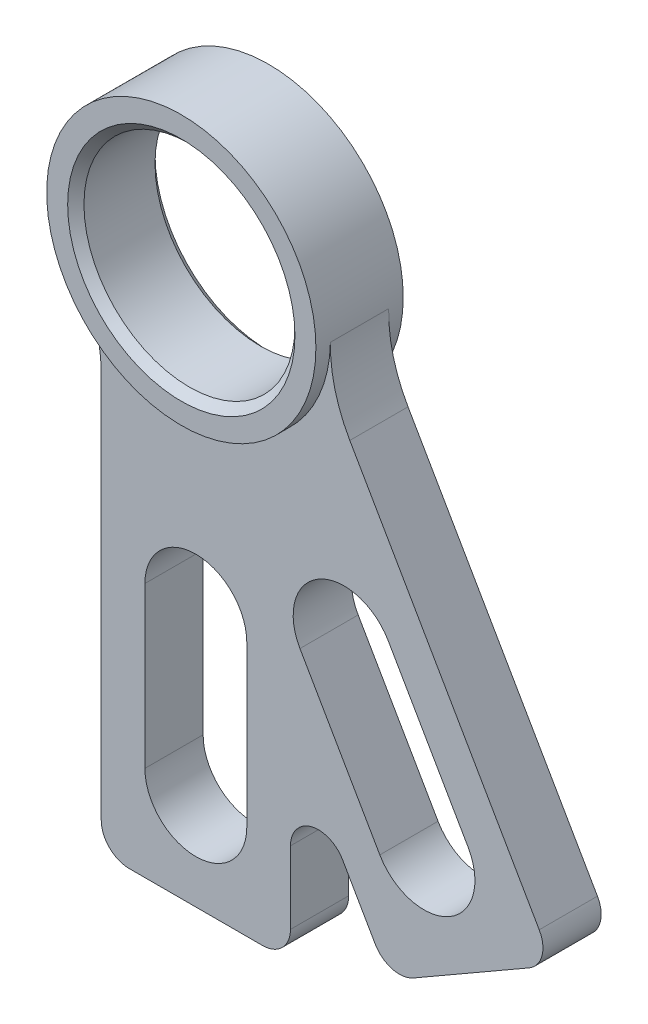
ISO-10303-21;
HEADER;
FILE_DESCRIPTION(('STEP AP214'),'2;1');
FILE_NAME('part.step','',(''),(''),'','','');
FILE_SCHEMA(('AUTOMOTIVE_DESIGN { 1 0 10303 214 1 1 1 1 }'));
ENDSEC;
DATA;
#1=APPLICATION_CONTEXT('core data for automotive mechanical design processes');
#2=APPLICATION_PROTOCOL_DEFINITION('international standard','automotive_design',2000,#1);
#3=PRODUCT_CONTEXT('',#1,'mechanical');
#4=PRODUCT('Part','Part','',(#3));
#5=PRODUCT_RELATED_PRODUCT_CATEGORY('part','',(#4));
#6=PRODUCT_DEFINITION_FORMATION('','',#4);
#7=PRODUCT_DEFINITION_CONTEXT('part definition',#1,'design');
#8=PRODUCT_DEFINITION('design','',#6,#7);
#9=PRODUCT_DEFINITION_SHAPE('','',#8);
#10=(LENGTH_UNIT() NAMED_UNIT(*) SI_UNIT(.MILLI.,.METRE.));
#11=(NAMED_UNIT(*) PLANE_ANGLE_UNIT() SI_UNIT($,.RADIAN.));
#12=(NAMED_UNIT(*) SI_UNIT($,.STERADIAN.) SOLID_ANGLE_UNIT());
#13=UNCERTAINTY_MEASURE_WITH_UNIT(LENGTH_MEASURE(1.E-05),#10,'distance_accuracy_value','');
#14=(GEOMETRIC_REPRESENTATION_CONTEXT(3) GLOBAL_UNCERTAINTY_ASSIGNED_CONTEXT((#13)) GLOBAL_UNIT_ASSIGNED_CONTEXT((#10,
#11,#12)) REPRESENTATION_CONTEXT('',''));
#15=CARTESIAN_POINT('',(0.,0.,0.));
#16=DIRECTION('',(0.,0.,1.));
#17=DIRECTION('',(1.,0.,0.));
#18=AXIS2_PLACEMENT_3D('',#15,#16,#17);
#19=CARTESIAN_POINT('',(-3.4936420527291E-13,-1.7668066561072E-13,4.7625));
#20=DIRECTION('',(0.,0.,-1.));
#21=DIRECTION('',(-1.,0.,0.));
#22=AXIS2_PLACEMENT_3D('',#19,#20,#21);
#23=CYLINDRICAL_SURFACE('',#22,11.5062000000004);
#24=CARTESIAN_POINT('',(-3.4936420527291E-13,-1.7668066561072E-13,-3.87350000000003));
#25=DIRECTION('',(0.,0.,1.));
#26=DIRECTION('',(1.,0.,0.));
#27=AXIS2_PLACEMENT_3D('',#24,#25,#26);
#28=CIRCLE('',#27,11.5062000000004);
#29=CARTESIAN_POINT('',(-11.5062000000007,-1.7668066561072E-13,-3.87350000000003));
#30=VERTEX_POINT('',#29);
#31=EDGE_CURVE('E56',#30,#30,#28,.F.);
#32=CARTESIAN_POINT('',(-3.4936420527291E-13,-1.7668066561072E-13,3.87349999999995));
#33=DIRECTION('',(0.,0.,1.));
#34=DIRECTION('',(1.,0.,0.));
#35=AXIS2_PLACEMENT_3D('',#32,#33,#34);
#36=CIRCLE('',#35,11.5062000000004);
#37=CARTESIAN_POINT('',(-11.5062000000007,-1.7668066561072E-13,3.87349999999995));
#38=VERTEX_POINT('',#37);
#39=EDGE_CURVE('E452',#38,#38,#36,.T.);
#40=CARTESIAN_POINT('',(-11.5062000000007,-1.7668066561072E-13,-3.87350000000003));
#41=CARTESIAN_POINT('',(-11.5062000000007,-1.7668066561072E-13,-3.79280208333336));
#42=CARTESIAN_POINT('',(-11.5062000000007,-1.7668066561072E-13,-3.71210416666669));
#43=CARTESIAN_POINT('',(-11.5062000000007,-1.7668066561072E-13,-3.55070833333336));
#44=CARTESIAN_POINT('',(-11.5062000000007,-1.7668066561072E-13,-3.47001041666669));
#45=CARTESIAN_POINT('',(-11.5062000000007,-1.7668066561072E-13,-3.30861458333336));
#46=CARTESIAN_POINT('',(-11.5062000000007,-1.7668066561072E-13,-3.2279166666667));
#47=CARTESIAN_POINT('',(-11.5062000000007,-1.7668066561072E-13,-3.06652083333336));
#48=CARTESIAN_POINT('',(-11.5062000000007,-1.7668066561072E-13,-2.9858229166667));
#49=CARTESIAN_POINT('',(-11.5062000000007,-1.7668066561072E-13,-2.82442708333336));
#50=CARTESIAN_POINT('',(-11.5062000000007,-1.7668066561072E-13,-2.7437291666667));
#51=CARTESIAN_POINT('',(-11.5062000000007,-1.7668066561072E-13,-2.58233333333336));
#52=CARTESIAN_POINT('',(-11.5062000000007,-1.7668066561072E-13,-2.5016354166667));
#53=CARTESIAN_POINT('',(-11.5062000000007,-1.7668066561072E-13,-2.34023958333337));
#54=CARTESIAN_POINT('',(-11.5062000000007,-1.7668066561072E-13,-2.2595416666667));
#55=CARTESIAN_POINT('',(-11.5062000000007,-1.7668066561072E-13,-2.09814583333337));
#56=CARTESIAN_POINT('',(-11.5062000000007,-1.7668066561072E-13,-2.0174479166667));
#57=CARTESIAN_POINT('',(-11.5062000000007,-1.7668066561072E-13,-1.85605208333337));
#58=CARTESIAN_POINT('',(-11.5062000000007,-1.7668066561072E-13,-1.7753541666667));
#59=CARTESIAN_POINT('',(-11.5062000000007,-1.7668066561072E-13,-1.61395833333337));
#60=CARTESIAN_POINT('',(-11.5062000000007,-1.7668066561072E-13,-1.5332604166667));
#61=CARTESIAN_POINT('',(-11.5062000000007,-1.7668066561072E-13,-1.37186458333337));
#62=CARTESIAN_POINT('',(-11.5062000000007,-1.7668066561072E-13,-1.2911666666667));
#63=CARTESIAN_POINT('',(-11.5062000000007,-1.7668066561072E-13,-1.12977083333337));
#64=CARTESIAN_POINT('',(-11.5062000000007,-1.7668066561072E-13,-1.0490729166667));
#65=CARTESIAN_POINT('',(-11.5062000000007,-1.7668066561072E-13,-0.887677083333368));
#66=CARTESIAN_POINT('',(-11.5062000000007,-1.7668066561072E-13,-0.806979166666702));
#67=CARTESIAN_POINT('',(-11.5062000000007,-1.7668066561072E-13,-0.645583333333369));
#68=CARTESIAN_POINT('',(-11.5062000000007,-1.7668066561072E-13,-0.564885416666703));
#69=CARTESIAN_POINT('',(-11.5062000000007,-1.7668066561072E-13,-0.40348958333337));
#70=CARTESIAN_POINT('',(-11.5062000000007,-1.7668066561072E-13,-0.322791666666703));
#71=CARTESIAN_POINT('',(-11.5062000000007,-1.7668066561072E-13,-0.16139583333337));
#72=CARTESIAN_POINT('',(-11.5062000000007,-1.7668066561072E-13,-0.0806979166667037));
#73=CARTESIAN_POINT('',(-11.5062000000007,-1.7668066561072E-13,0.0806979166666291));
#74=CARTESIAN_POINT('',(-11.5062000000007,-1.7668066561072E-13,0.161395833333296));
#75=CARTESIAN_POINT('',(-11.5062000000007,-1.7668066561072E-13,0.322791666666628));
#76=CARTESIAN_POINT('',(-11.5062000000007,-1.7668066561072E-13,0.403489583333295));
#77=CARTESIAN_POINT('',(-11.5062000000007,-1.7668066561072E-13,0.564885416666628));
#78=CARTESIAN_POINT('',(-11.5062000000007,-1.7668066561072E-13,0.645583333333295));
#79=CARTESIAN_POINT('',(-11.5062000000007,-1.7668066561072E-13,0.806979166666628));
#80=CARTESIAN_POINT('',(-11.5062000000007,-1.7668066561072E-13,0.887677083333294));
#81=CARTESIAN_POINT('',(-11.5062000000007,-1.7668066561072E-13,1.04907291666663));
#82=CARTESIAN_POINT('',(-11.5062000000007,-1.7668066561072E-13,1.12977083333329));
#83=CARTESIAN_POINT('',(-11.5062000000007,-1.7668066561072E-13,1.29116666666663));
#84=CARTESIAN_POINT('',(-11.5062000000007,-1.7668066561072E-13,1.37186458333329));
#85=CARTESIAN_POINT('',(-11.5062000000007,-1.7668066561072E-13,1.53326041666663));
#86=CARTESIAN_POINT('',(-11.5062000000007,-1.7668066561072E-13,1.61395833333329));
#87=CARTESIAN_POINT('',(-11.5062000000007,-1.7668066561072E-13,1.77535416666662));
#88=CARTESIAN_POINT('',(-11.5062000000007,-1.7668066561072E-13,1.85605208333329));
#89=CARTESIAN_POINT('',(-11.5062000000007,-1.7668066561072E-13,2.01744791666662));
#90=CARTESIAN_POINT('',(-11.5062000000007,-1.7668066561072E-13,2.09814583333329));
#91=CARTESIAN_POINT('',(-11.5062000000007,-1.7668066561072E-13,2.25954166666662));
#92=CARTESIAN_POINT('',(-11.5062000000007,-1.7668066561072E-13,2.34023958333329));
#93=CARTESIAN_POINT('',(-11.5062000000007,-1.7668066561072E-13,2.50163541666662));
#94=CARTESIAN_POINT('',(-11.5062000000007,-1.7668066561072E-13,2.58233333333329));
#95=CARTESIAN_POINT('',(-11.5062000000007,-1.7668066561072E-13,2.74372916666662));
#96=CARTESIAN_POINT('',(-11.5062000000007,-1.7668066561072E-13,2.82442708333329));
#97=CARTESIAN_POINT('',(-11.5062000000007,-1.7668066561072E-13,2.98582291666662));
#98=CARTESIAN_POINT('',(-11.5062000000007,-1.7668066561072E-13,3.06652083333329));
#99=CARTESIAN_POINT('',(-11.5062000000007,-1.7668066561072E-13,3.22791666666662));
#100=CARTESIAN_POINT('',(-11.5062000000007,-1.7668066561072E-13,3.30861458333329));
#101=CARTESIAN_POINT('',(-11.5062000000007,-1.7668066561072E-13,3.47001041666662));
#102=CARTESIAN_POINT('',(-11.5062000000007,-1.7668066561072E-13,3.55070833333329));
#103=CARTESIAN_POINT('',(-11.5062000000007,-1.7668066561072E-13,3.71210416666662));
#104=CARTESIAN_POINT('',(-11.5062000000007,-1.7668066561072E-13,3.79280208333329));
#105=CARTESIAN_POINT('',(-11.5062000000007,-1.7668066561072E-13,3.87349999999995));
#106=B_SPLINE_CURVE_WITH_KNOTS('',3,(#40,#41,#42,#43,#44,#45,#46,#47,#48,#49,#50,#51,#52,#53,
#54,#55,#56,#57,#58,#59,#60,#61,#62,#63,#64,#65,#66,#67,#68,#69,#70,#71,#72,#73,#74,#75,#76,#77,
#78,#79,#80,#81,#82,#83,#84,#85,#86,#87,#88,#89,#90,#91,#92,#93,#94,#95,#96,#97,#98,#99,#100,
#101,#102,#103,#104,#105),.UNSPECIFIED.,.F.,.F.,(4,2,2,2,2,2,2,2,2,2,2,2,2,2,2,2,2,2,2,2,2,2,2,
2,2,2,2,2,2,2,2,2,4),(0.,0.24209375,0.484187499999998,0.726281249999999,0.968374999999997,
1.21046875,1.4525625,1.69465624999999,1.93674999999999,2.17884374999999,2.42093749999999,
2.66303124999999,2.90512499999999,3.14721874999999,3.38931249999999,3.63140624999999,
3.87349999999999,4.11559374999999,4.35768749999999,4.59978124999999,4.84187499999999,
5.08396874999999,5.32606249999999,5.56815624999998,5.81024999999998,6.05234374999998,
6.29443749999998,6.53653124999998,6.77862499999998,7.02071874999998,7.26281249999998,
7.50490624999998,7.74699999999998),.UNSPECIFIED.);
#107=EDGE_CURVE('BSEAM47',#30,#38,#106,.T.);
#108=ORIENTED_EDGE('',*,*,#31,.T.);
#109=ORIENTED_EDGE('',*,*,#39,.T.);
#110=ORIENTED_EDGE('',*,*,#107,.T.);
#111=ORIENTED_EDGE('',*,*,#107,.F.);
#112=EDGE_LOOP('',(#108,#110,#109,#111));
#113=FACE_BOUND('',#112,.T.);
#114=ADVANCED_FACE('F47',(#113),#23,.F.);
#115=CARTESIAN_POINT('',(-3.4936420527291E-13,-1.7668066561072E-13,4.7625));
#116=DIRECTION('',(0.,0.,-1.));
#117=DIRECTION('',(-1.,0.,0.));
#118=AXIS2_PLACEMENT_3D('',#115,#116,#117);
#119=CYLINDRICAL_SURFACE('',#118,14.6812);
#120=DIRECTION('',(0.,0.,-1.));
#121=VECTOR('',#120,1.);
#122=CARTESIAN_POINT('',(-12.5851932668323,-7.55979787272707,3.175));
#123=LINE('',#122,#121);
#124=CARTESIAN_POINT('',(-12.585193266832,-7.55979787272686,3.175));
#125=VERTEX_POINT('',#124);
#126=CARTESIAN_POINT('',(-12.5851932668323,-7.55979787272707,-3.175));
#127=VERTEX_POINT('',#126);
#128=EDGE_CURVE('E211',#125,#127,#123,.T.);
#129=ORIENTED_EDGE('',*,*,#128,.F.);
#130=CARTESIAN_POINT('',(-3.4936420527291E-13,-1.7668066561072E-13,3.175));
#131=DIRECTION('',(0.,0.,1.));
#132=DIRECTION('',(1.,0.,0.));
#133=AXIS2_PLACEMENT_3D('',#130,#131,#132);
#134=CIRCLE('',#133,14.6812);
#135=CARTESIAN_POINT('',(14.6786412074877,-0.274090754757125,3.175));
#136=VERTEX_POINT('',#135);
#137=EDGE_CURVE('E228',#125,#136,#134,.T.);
#138=ORIENTED_EDGE('',*,*,#137,.T.);
#139=DIRECTION('',(0.,0.,-1.));
#140=VECTOR('',#139,1.);
#141=CARTESIAN_POINT('',(14.6786412074874,-0.274090754757023,3.175));
#142=LINE('',#141,#140);
#143=CARTESIAN_POINT('',(14.6786412074874,-0.274090754757023,-3.175));
#144=VERTEX_POINT('',#143);
#145=EDGE_CURVE('E284',#136,#144,#142,.T.);
#146=ORIENTED_EDGE('',*,*,#145,.T.);
#147=CARTESIAN_POINT('',(-3.4936420527291E-13,-1.7668066561072E-13,-3.175));
#148=DIRECTION('',(0.,0.,1.));
#149=DIRECTION('',(1.,0.,0.));
#150=AXIS2_PLACEMENT_3D('',#147,#148,#149);
#151=CIRCLE('',#150,14.6812);
#152=EDGE_CURVE('E285',#127,#144,#151,.T.);
#153=ORIENTED_EDGE('',*,*,#152,.F.);
#154=EDGE_LOOP('',(#129,#138,#146,#153));
#155=FACE_BOUND('',#154,.T.);
#156=CARTESIAN_POINT('',(-3.4936420527291E-13,-1.7668066561072E-13,4.7625));
#157=DIRECTION('',(0.,0.,1.));
#158=DIRECTION('',(1.,0.,0.));
#159=AXIS2_PLACEMENT_3D('',#156,#157,#158);
#160=CIRCLE('',#159,14.6812);
#161=CARTESIAN_POINT('',(14.6811999999996,-1.7668066561072E-13,4.7625));
#162=VERTEX_POINT('',#161);
#163=EDGE_CURVE('E379',#162,#162,#160,.T.);
#164=ORIENTED_EDGE('',*,*,#163,.F.);
#165=EDGE_LOOP('',(#164));
#166=FACE_BOUND('',#165,.T.);
#167=CARTESIAN_POINT('',(-3.4936420527291E-13,-1.7668066561072E-13,-4.7625));
#168=DIRECTION('',(0.,0.,1.));
#169=DIRECTION('',(1.,0.,0.));
#170=AXIS2_PLACEMENT_3D('',#167,#168,#169);
#171=CIRCLE('',#170,14.6812);
#172=CARTESIAN_POINT('',(14.6811999999996,-1.7668066561072E-13,-4.7625));
#173=VERTEX_POINT('',#172);
#174=EDGE_CURVE('E360',#173,#173,#171,.T.);
#175=ORIENTED_EDGE('',*,*,#174,.T.);
#176=EDGE_LOOP('',(#175));
#177=FACE_BOUND('',#176,.T.);
#178=ADVANCED_FACE('F475',(#155,#166,#177),#119,.T.);
#179=CARTESIAN_POINT('',(0.,0.,4.7625));
#180=DIRECTION('',(0.,0.,1.));
#181=DIRECTION('',(1.,0.,0.));
#182=AXIS2_PLACEMENT_3D('',#179,#180,#181);
#183=PLANE('',#182);
#184=CARTESIAN_POINT('',(-3.4936420527291E-13,-1.7668066561072E-13,4.7625));
#185=DIRECTION('',(0.,0.,1.));
#186=DIRECTION('',(1.,0.,0.));
#187=AXIS2_PLACEMENT_3D('',#184,#185,#186);
#188=CIRCLE('',#187,12.3952000000004);
#189=CARTESIAN_POINT('',(12.3952000000001,-1.7668066561072E-13,4.7625));
#190=VERTEX_POINT('',#189);
#191=EDGE_CURVE('E11',#190,#190,#188,.F.);
#192=ORIENTED_EDGE('',*,*,#191,.T.);
#193=EDGE_LOOP('',(#192));
#194=FACE_BOUND('',#193,.T.);
#195=ORIENTED_EDGE('',*,*,#163,.T.);
#196=EDGE_LOOP('',(#195));
#197=FACE_BOUND('',#196,.T.);
#198=ADVANCED_FACE('F471',(#194,#197),#183,.T.);
#199=CARTESIAN_POINT('',(0.,0.,-4.7625));
#200=DIRECTION('',(0.,0.,1.));
#201=DIRECTION('',(1.,0.,0.));
#202=AXIS2_PLACEMENT_3D('',#199,#200,#201);
#203=PLANE('',#202);
#204=CARTESIAN_POINT('',(-3.4936420527291E-13,-1.7668066561072E-13,-4.7625));
#205=DIRECTION('',(0.,0.,1.));
#206=DIRECTION('',(1.,0.,0.));
#207=AXIS2_PLACEMENT_3D('',#204,#205,#206);
#208=CIRCLE('',#207,12.3952000000004);
#209=CARTESIAN_POINT('',(12.3952,-1.7668066561072E-13,-4.7625));
#210=VERTEX_POINT('',#209);
#211=EDGE_CURVE('E448',#210,#210,#208,.T.);
#212=ORIENTED_EDGE('',*,*,#211,.T.);
#213=EDGE_LOOP('',(#212));
#214=FACE_BOUND('',#213,.T.);
#215=ORIENTED_EDGE('',*,*,#174,.F.);
#216=EDGE_LOOP('',(#215));
#217=FACE_BOUND('',#216,.T.);
#218=ADVANCED_FACE('F467',(#214,#217),#203,.F.);
#219=CARTESIAN_POINT('',(0.,-33.1787499999983,3.175));
#220=DIRECTION('',(0.,0.,-1.));
#221=DIRECTION('',(-1.,0.,0.));
#222=AXIS2_PLACEMENT_3D('',#219,#220,#221);
#223=CYLINDRICAL_SURFACE('',#222,5.55624999999838);
#224=CARTESIAN_POINT('',(0.,-33.1787499999983,-3.175));
#225=DIRECTION('',(0.,0.,1.));
#226=DIRECTION('',(1.,0.,0.));
#227=AXIS2_PLACEMENT_3D('',#224,#225,#226);
#228=CIRCLE('',#227,5.55624999999838);
#229=CARTESIAN_POINT('',(5.55624999999832,-33.1787499999983,-3.175));
#230=VERTEX_POINT('',#229);
#231=CARTESIAN_POINT('',(-5.55624999999843,-33.1787499999983,-3.175));
#232=VERTEX_POINT('',#231);
#233=EDGE_CURVE('E332',#230,#232,#228,.T.);
#234=ORIENTED_EDGE('',*,*,#233,.F.);
#235=DIRECTION('',(0.,0.,-1.));
#236=VECTOR('',#235,1.);
#237=CARTESIAN_POINT('',(5.55624999999832,-33.1787499999983,3.175));
#238=LINE('',#237,#236);
#239=CARTESIAN_POINT('',(5.55624999999832,-33.1787499999983,3.175));
#240=VERTEX_POINT('',#239);
#241=EDGE_CURVE('E357',#240,#230,#238,.T.);
#242=ORIENTED_EDGE('',*,*,#241,.F.);
#243=CARTESIAN_POINT('',(0.,-33.1787499999983,3.175));
#244=DIRECTION('',(0.,0.,1.));
#245=DIRECTION('',(1.,0.,0.));
#246=AXIS2_PLACEMENT_3D('',#243,#244,#245);
#247=CIRCLE('',#246,5.55624999999838);
#248=CARTESIAN_POINT('',(-5.55624999999843,-33.1787499999983,3.175));
#249=VERTEX_POINT('',#248);
#250=EDGE_CURVE('E269',#240,#249,#247,.T.);
#251=ORIENTED_EDGE('',*,*,#250,.T.);
#252=DIRECTION('',(0.,0.,-1.));
#253=VECTOR('',#252,1.);
#254=CARTESIAN_POINT('',(-5.55624999999843,-33.1787499999983,3.175));
#255=LINE('',#254,#253);
#256=EDGE_CURVE('E347',#249,#232,#255,.T.);
#257=ORIENTED_EDGE('',*,*,#256,.T.);
#258=EDGE_LOOP('',(#234,#242,#251,#257));
#259=FACE_BOUND('',#258,.T.);
#260=ADVANCED_FACE('F470',(#259),#223,.F.);
#261=CARTESIAN_POINT('',(5.55624999999827,0.,3.175));
#262=DIRECTION('',(-1.,0.,0.));
#263=DIRECTION('',(0.,-1.,0.));
#264=AXIS2_PLACEMENT_3D('',#261,#262,#263);
#265=PLANE('',#264);
#266=DIRECTION('',(0.,1.,0.));
#267=VECTOR('',#266,1.);
#268=CARTESIAN_POINT('',(5.55624999999827,0.,-3.175));
#269=LINE('',#268,#267);
#270=CARTESIAN_POINT('',(5.55624999999835,-50.6412500000016,-3.175));
#271=VERTEX_POINT('',#270);
#272=EDGE_CURVE('E336',#271,#230,#269,.T.);
#273=ORIENTED_EDGE('',*,*,#272,.F.);
#274=DIRECTION('',(0.,0.,-1.));
#275=VECTOR('',#274,1.);
#276=CARTESIAN_POINT('',(5.55624999999835,-50.6412500000016,3.175));
#277=LINE('',#276,#275);
#278=CARTESIAN_POINT('',(5.55624999999835,-50.6412500000016,3.175));
#279=VERTEX_POINT('',#278);
#280=EDGE_CURVE('E354',#279,#271,#277,.T.);
#281=ORIENTED_EDGE('',*,*,#280,.F.);
#282=DIRECTION('',(0.,1.,0.));
#283=VECTOR('',#282,1.);
#284=CARTESIAN_POINT('',(5.55624999999827,0.,3.175));
#285=LINE('',#284,#283);
#286=EDGE_CURVE('E273',#279,#240,#285,.T.);
#287=ORIENTED_EDGE('',*,*,#286,.T.);
#288=ORIENTED_EDGE('',*,*,#241,.T.);
#289=EDGE_LOOP('',(#273,#281,#287,#288));
#290=FACE_BOUND('',#289,.T.);
#291=ADVANCED_FACE('F615',(#290),#265,.T.);
#292=CARTESIAN_POINT('',(-1.15768157845534E-13,-50.6412500000016,3.175));
#293=DIRECTION('',(0.,0.,-1.));
#294=DIRECTION('',(-1.,0.,0.));
#295=AXIS2_PLACEMENT_3D('',#292,#293,#294);
#296=CYLINDRICAL_SURFACE('',#295,5.5562499999984);
#297=CARTESIAN_POINT('',(-1.15768157845534E-13,-50.6412500000016,-3.175));
#298=DIRECTION('',(0.,0.,1.));
#299=DIRECTION('',(1.,0.,0.));
#300=AXIS2_PLACEMENT_3D('',#297,#298,#299);
#301=CIRCLE('',#300,5.5562499999984);
#302=CARTESIAN_POINT('',(-5.55624999999846,-50.6412500000016,-3.175));
#303=VERTEX_POINT('',#302);
#304=EDGE_CURVE('E340',#303,#271,#301,.T.);
#305=ORIENTED_EDGE('',*,*,#304,.F.);
#306=DIRECTION('',(0.,0.,-1.));
#307=VECTOR('',#306,1.);
#308=CARTESIAN_POINT('',(-5.55624999999846,-50.6412500000016,3.175));
#309=LINE('',#308,#307);
#310=CARTESIAN_POINT('',(-5.55624999999846,-50.6412500000016,3.175));
#311=VERTEX_POINT('',#310);
#312=EDGE_CURVE('E350',#311,#303,#309,.T.);
#313=ORIENTED_EDGE('',*,*,#312,.F.);
#314=CARTESIAN_POINT('',(-1.15768157845534E-13,-50.6412500000016,3.175));
#315=DIRECTION('',(0.,0.,1.));
#316=DIRECTION('',(1.,0.,0.));
#317=AXIS2_PLACEMENT_3D('',#314,#315,#316);
#318=CIRCLE('',#317,5.5562499999984);
#319=EDGE_CURVE('E277',#311,#279,#318,.T.);
#320=ORIENTED_EDGE('',*,*,#319,.T.);
#321=ORIENTED_EDGE('',*,*,#280,.T.);
#322=EDGE_LOOP('',(#305,#313,#320,#321));
#323=FACE_BOUND('',#322,.T.);
#324=ADVANCED_FACE('F583',(#323),#296,.F.);
#325=CARTESIAN_POINT('',(16.1699182596924,-28.0941728733446,3.175));
#326=DIRECTION('',(0.,0.,-1.));
#327=DIRECTION('',(-1.,0.,0.));
#328=AXIS2_PLACEMENT_3D('',#325,#326,#327);
#329=CYLINDRICAL_SURFACE('',#328,5.55624999999839);
#330=CARTESIAN_POINT('',(16.1699182596924,-28.0941728733446,-3.175));
#331=DIRECTION('',(0.,0.,1.));
#332=DIRECTION('',(1.,0.,0.));
#333=AXIS2_PLACEMENT_3D('',#330,#331,#332);
#334=CIRCLE('',#333,5.55624999999839);
#335=CARTESIAN_POINT('',(20.9854979726825,-25.3225116223398,-3.175));
#336=VERTEX_POINT('',#335);
#337=CARTESIAN_POINT('',(11.3543385467024,-30.8658341243493,-3.175));
#338=VERTEX_POINT('',#337);
#339=EDGE_CURVE('E316',#336,#338,#334,.T.);
#340=ORIENTED_EDGE('',*,*,#339,.F.);
#341=DIRECTION('',(0.,0.,-1.));
#342=VECTOR('',#341,1.);
#343=CARTESIAN_POINT('',(20.9854979726825,-25.3225116223398,3.175));
#344=LINE('',#343,#342);
#345=CARTESIAN_POINT('',(20.9854979726825,-25.3225116223398,3.175));
#346=VERTEX_POINT('',#345);
#347=EDGE_CURVE('E351',#346,#336,#344,.T.);
#348=ORIENTED_EDGE('',*,*,#347,.F.);
#349=CARTESIAN_POINT('',(16.1699182596924,-28.0941728733446,3.175));
#350=DIRECTION('',(0.,0.,1.));
#351=DIRECTION('',(1.,0.,0.));
#352=AXIS2_PLACEMENT_3D('',#349,#350,#351);
#353=CIRCLE('',#352,5.55624999999839);
#354=CARTESIAN_POINT('',(11.3543385467024,-30.8658341243493,3.175));
#355=VERTEX_POINT('',#354);
#356=EDGE_CURVE('E254',#346,#355,#353,.T.);
#357=ORIENTED_EDGE('',*,*,#356,.T.);
#358=DIRECTION('',(0.,0.,-1.));
#359=VECTOR('',#358,1.);
#360=CARTESIAN_POINT('',(11.3543385467024,-30.8658341243493,3.175));
#361=LINE('',#360,#359);
#362=EDGE_CURVE('E361',#355,#338,#361,.T.);
#363=ORIENTED_EDGE('',*,*,#362,.T.);
#364=EDGE_LOOP('',(#340,#348,#357,#363));
#365=FACE_BOUND('',#364,.T.);
#366=ADVANCED_FACE('F575',(#365),#329,.F.);
#367=CARTESIAN_POINT('',(4.81557971299104,2.77166125100526,3.175));
#368=DIRECTION('',(-0.866696011337042,-0.498836670597163,0.));
#369=DIRECTION('',(0.498836670597163,-0.866696011337042,0.));
#370=AXIS2_PLACEMENT_3D('',#367,#368,#369);
#371=PLANE('',#370);
#372=DIRECTION('',(-0.498836670597163,0.866696011337042,0.));
#373=VECTOR('',#372,1.);
#374=CARTESIAN_POINT('',(4.81557971299104,2.77166125100526,-3.175));
#375=LINE('',#374,#373);
#376=CARTESIAN_POINT('',(29.6964333329867,-40.4571907203151,-3.175));
#377=VERTEX_POINT('',#376);
#378=EDGE_CURVE('E320',#377,#336,#375,.T.);
#379=ORIENTED_EDGE('',*,*,#378,.F.);
#380=DIRECTION('',(0.,0.,-1.));
#381=VECTOR('',#380,1.);
#382=CARTESIAN_POINT('',(29.6964333329867,-40.4571907203151,3.175));
#383=LINE('',#382,#381);
#384=CARTESIAN_POINT('',(29.6964333329867,-40.4571907203151,3.175));
#385=VERTEX_POINT('',#384);
#386=EDGE_CURVE('E367',#385,#377,#383,.T.);
#387=ORIENTED_EDGE('',*,*,#386,.F.);
#388=DIRECTION('',(-0.498836670597163,0.866696011337042,0.));
#389=VECTOR('',#388,1.);
#390=CARTESIAN_POINT('',(4.81557971299104,2.77166125100526,3.175));
#391=LINE('',#390,#389);
#392=EDGE_CURVE('E258',#385,#346,#391,.T.);
#393=ORIENTED_EDGE('',*,*,#392,.T.);
#394=ORIENTED_EDGE('',*,*,#347,.T.);
#395=EDGE_LOOP('',(#379,#387,#393,#394));
#396=FACE_BOUND('',#395,.T.);
#397=ADVANCED_FACE('F569',(#396),#371,.T.);
#398=CARTESIAN_POINT('',(24.8808536199966,-43.2288519713197,3.175));
#399=DIRECTION('',(0.,0.,-1.));
#400=DIRECTION('',(-1.,0.,0.));
#401=AXIS2_PLACEMENT_3D('',#398,#399,#400);
#402=CYLINDRICAL_SURFACE('',#401,5.55624999999839);
#403=CARTESIAN_POINT('',(24.8808536199966,-43.2288519713197,-3.175));
#404=DIRECTION('',(0.,0.,1.));
#405=DIRECTION('',(1.,0.,0.));
#406=AXIS2_PLACEMENT_3D('',#403,#404,#405);
#407=CIRCLE('',#406,5.55624999999839);
#408=CARTESIAN_POINT('',(20.0652739070066,-46.0005132223244,-3.175));
#409=VERTEX_POINT('',#408);
#410=EDGE_CURVE('E324',#409,#377,#407,.T.);
#411=ORIENTED_EDGE('',*,*,#410,.F.);
#412=DIRECTION('',(0.,0.,-1.));
#413=VECTOR('',#412,1.);
#414=CARTESIAN_POINT('',(20.0652739070066,-46.0005132223244,3.175));
#415=LINE('',#414,#413);
#416=CARTESIAN_POINT('',(20.0652739070066,-46.0005132223244,3.175));
#417=VERTEX_POINT('',#416);
#418=EDGE_CURVE('E364',#417,#409,#415,.T.);
#419=ORIENTED_EDGE('',*,*,#418,.F.);
#420=CARTESIAN_POINT('',(24.8808536199966,-43.2288519713197,3.175));
#421=DIRECTION('',(0.,0.,1.));
#422=DIRECTION('',(1.,0.,0.));
#423=AXIS2_PLACEMENT_3D('',#420,#421,#422);
#424=CIRCLE('',#423,5.55624999999839);
#425=EDGE_CURVE('E262',#417,#385,#424,.T.);
#426=ORIENTED_EDGE('',*,*,#425,.T.);
#427=ORIENTED_EDGE('',*,*,#386,.T.);
#428=EDGE_LOOP('',(#411,#419,#426,#427));
#429=FACE_BOUND('',#428,.T.);
#430=ADVANCED_FACE('F564',(#429),#402,.F.);
#431=CARTESIAN_POINT('',(-26.1937499999968,-15.7343197939273,3.175));
#432=DIRECTION('',(0.,0.,-1.));
#433=DIRECTION('',(-1.,0.,0.));
#434=AXIS2_PLACEMENT_3D('',#431,#432,#433);
#435=CYLINDRICAL_SURFACE('',#434,15.8749999999984);
#436=CARTESIAN_POINT('',(-26.1937499999968,-15.7343197939273,-3.175));
#437=DIRECTION('',(0.,0.,1.));
#438=DIRECTION('',(1.,0.,0.));
#439=AXIS2_PLACEMENT_3D('',#436,#437,#438);
#440=CIRCLE('',#439,15.8749999999984);
#441=CARTESIAN_POINT('',(-10.3187499999984,-15.7343197939273,-3.175));
#442=VERTEX_POINT('',#441);
#443=EDGE_CURVE('E206',#442,#127,#440,.T.);
#444=ORIENTED_EDGE('',*,*,#443,.F.);
#445=DIRECTION('',(0.,0.,-1.));
#446=VECTOR('',#445,1.);
#447=CARTESIAN_POINT('',(-10.3187499999984,-15.7343197939273,3.175));
#448=LINE('',#447,#446);
#449=CARTESIAN_POINT('',(-10.3187499999984,-15.7343197939273,3.175));
#450=VERTEX_POINT('',#449);
#451=EDGE_CURVE('E199',#450,#442,#448,.T.);
#452=ORIENTED_EDGE('',*,*,#451,.F.);
#453=CARTESIAN_POINT('',(-26.1937499999968,-15.7343197939273,3.175));
#454=DIRECTION('',(0.,0.,1.));
#455=DIRECTION('',(1.,0.,0.));
#456=AXIS2_PLACEMENT_3D('',#453,#454,#455);
#457=CIRCLE('',#456,15.8749999999984);
#458=EDGE_CURVE('E204',#450,#125,#457,.T.);
#459=ORIENTED_EDGE('',*,*,#458,.T.);
#460=ORIENTED_EDGE('',*,*,#128,.T.);
#461=EDGE_LOOP('',(#444,#452,#459,#460));
#462=FACE_BOUND('',#461,.T.);
#463=ADVANCED_FACE('F201',(#462),#435,.F.);
#464=CARTESIAN_POINT('',(-10.3187499999983,0.,3.175));
#465=DIRECTION('',(1.,0.,0.));
#466=DIRECTION('',(0.,1.,0.));
#467=AXIS2_PLACEMENT_3D('',#464,#465,#466);
#468=PLANE('',#467);
#469=DIRECTION('',(0.,-1.,0.));
#470=VECTOR('',#469,1.);
#471=CARTESIAN_POINT('',(-10.3187499999983,0.,-3.175));
#472=LINE('',#471,#470);
#473=CARTESIAN_POINT('',(-10.3187499999985,-57.912,-3.175));
#474=VERTEX_POINT('',#473);
#475=EDGE_CURVE('E291',#442,#474,#472,.T.);
#476=ORIENTED_EDGE('',*,*,#475,.T.);
#477=DIRECTION('',(0.,0.,-1.));
#478=VECTOR('',#477,1.);
#479=CARTESIAN_POINT('',(-10.3187499999985,-57.912,3.175));
#480=LINE('',#479,#478);
#481=CARTESIAN_POINT('',(-10.3187499999985,-57.912,3.175));
#482=VERTEX_POINT('',#481);
#483=EDGE_CURVE('E218',#474,#482,#480,.F.);
#484=ORIENTED_EDGE('',*,*,#483,.T.);
#485=DIRECTION('',(0.,-1.,0.));
#486=VECTOR('',#485,1.);
#487=CARTESIAN_POINT('',(-10.3187499999983,0.,3.175));
#488=LINE('',#487,#486);
#489=EDGE_CURVE('E215',#450,#482,#488,.T.);
#490=ORIENTED_EDGE('',*,*,#489,.F.);
#491=ORIENTED_EDGE('',*,*,#451,.T.);
#492=EDGE_LOOP('',(#476,#484,#490,#491));
#493=FACE_BOUND('',#492,.T.);
#494=ADVANCED_FACE('F216',(#493),#468,.F.);
#495=CARTESIAN_POINT('',(0.,-60.96,3.175));
#496=DIRECTION('',(0.,1.,0.));
#497=DIRECTION('',(0.,0.,1.));
#498=AXIS2_PLACEMENT_3D('',#495,#496,#497);
#499=PLANE('',#498);
#500=DIRECTION('',(1.,0.,0.));
#501=VECTOR('',#500,1.);
#502=CARTESIAN_POINT('',(0.,-60.96,-3.175));
#503=LINE('',#502,#501);
#504=CARTESIAN_POINT('',(-7.27074999999846,-60.96,-3.175));
#505=VERTEX_POINT('',#504);
#506=CARTESIAN_POINT('',(7.27074999999826,-60.96,-3.175));
#507=VERTEX_POINT('',#506);
#508=EDGE_CURVE('E294',#505,#507,#503,.T.);
#509=ORIENTED_EDGE('',*,*,#508,.T.);
#510=DIRECTION('',(0.,0.,-1.));
#511=VECTOR('',#510,1.);
#512=CARTESIAN_POINT('',(7.27074999999826,-60.96,3.175));
#513=LINE('',#512,#511);
#514=CARTESIAN_POINT('',(7.27074999999826,-60.96,3.175));
#515=VERTEX_POINT('',#514);
#516=EDGE_CURVE('E416',#507,#515,#513,.F.);
#517=ORIENTED_EDGE('',*,*,#516,.T.);
#518=DIRECTION('',(1.,0.,0.));
#519=VECTOR('',#518,1.);
#520=CARTESIAN_POINT('',(0.,-60.96,3.175));
#521=LINE('',#520,#519);
#522=CARTESIAN_POINT('',(-7.27074999999846,-60.96,3.175));
#523=VERTEX_POINT('',#522);
#524=EDGE_CURVE('E221',#523,#515,#521,.T.);
#525=ORIENTED_EDGE('',*,*,#524,.F.);
#526=DIRECTION('',(0.,0.,-1.));
#527=VECTOR('',#526,1.);
#528=CARTESIAN_POINT('',(-7.27074999999846,-60.96,3.175));
#529=LINE('',#528,#527);
#530=EDGE_CURVE('E412',#523,#505,#529,.T.);
#531=ORIENTED_EDGE('',*,*,#530,.T.);
#532=EDGE_LOOP('',(#509,#517,#525,#531));
#533=FACE_BOUND('',#532,.T.);
#534=ADVANCED_FACE('F529',(#533),#499,.F.);
#535=CARTESIAN_POINT('',(10.3187499999985,0.,3.175));
#536=DIRECTION('',(-1.,0.,0.));
#537=DIRECTION('',(0.,-1.,0.));
#538=AXIS2_PLACEMENT_3D('',#535,#536,#537);
#539=PLANE('',#538);
#540=DIRECTION('',(0.,1.,0.));
#541=VECTOR('',#540,1.);
#542=CARTESIAN_POINT('',(10.3187499999985,0.,-3.175));
#543=LINE('',#542,#541);
#544=CARTESIAN_POINT('',(10.3187499999983,-57.912,-3.175));
#545=VERTEX_POINT('',#544);
#546=CARTESIAN_POINT('',(10.3187499999983,-50.019696586591,-3.175));
#547=VERTEX_POINT('',#546);
#548=EDGE_CURVE('E298',#545,#547,#543,.T.);
#549=ORIENTED_EDGE('',*,*,#548,.T.);
#550=DIRECTION('',(0.,0.,-1.));
#551=VECTOR('',#550,1.);
#552=CARTESIAN_POINT('',(10.3187499999983,-50.019696586591,3.175));
#553=LINE('',#552,#551);
#554=CARTESIAN_POINT('',(10.3187499999983,-50.019696586591,3.175));
#555=VERTEX_POINT('',#554);
#556=EDGE_CURVE('E397',#547,#555,#553,.F.);
#557=ORIENTED_EDGE('',*,*,#556,.T.);
#558=DIRECTION('',(0.,1.,0.));
#559=VECTOR('',#558,1.);
#560=CARTESIAN_POINT('',(10.3187499999985,0.,3.175));
#561=LINE('',#560,#559);
#562=CARTESIAN_POINT('',(10.3187499999983,-57.912,3.175));
#563=VERTEX_POINT('',#562);
#564=EDGE_CURVE('E237',#563,#555,#561,.T.);
#565=ORIENTED_EDGE('',*,*,#564,.F.);
#566=DIRECTION('',(0.,0.,-1.));
#567=VECTOR('',#566,1.);
#568=CARTESIAN_POINT('',(10.3187499999983,-57.912,3.175));
#569=LINE('',#568,#567);
#570=EDGE_CURVE('E393',#563,#545,#569,.T.);
#571=ORIENTED_EDGE('',*,*,#570,.T.);
#572=EDGE_LOOP('',(#549,#557,#565,#571));
#573=FACE_BOUND('',#572,.T.);
#574=ADVANCED_FACE('F535',(#573),#539,.F.);
#575=CARTESIAN_POINT('',(-8.94321946698161,-5.14737089472297,3.175));
#576=DIRECTION('',(-0.866696011337045,-0.498836670597158,0.));
#577=DIRECTION('',(0.498836670597158,-0.866696011337045,0.));
#578=AXIS2_PLACEMENT_3D('',#575,#576,#577);
#579=PLANE('',#578);
#580=DIRECTION('',(-0.498836670597158,0.866696011337045,0.));
#581=VECTOR('',#580,1.);
#582=CARTESIAN_POINT('',(-8.94321946698161,-5.14737089472297,3.175));
#583=LINE('',#582,#581);
#584=CARTESIAN_POINT('',(19.5645508757572,-54.6777528904708,3.175));
#585=VERTEX_POINT('',#584);
#586=CARTESIAN_POINT('',(16.0084394425536,-48.4992424146108,3.175));
#587=VERTEX_POINT('',#586);
#588=EDGE_CURVE('E241',#585,#587,#583,.T.);
#589=ORIENTED_EDGE('',*,*,#588,.T.);
#590=DIRECTION('',(0.,0.,-1.));
#591=VECTOR('',#590,1.);
#592=CARTESIAN_POINT('',(16.0084394425536,-48.4992424146108,3.175));
#593=LINE('',#592,#591);
#594=CARTESIAN_POINT('',(16.0084394425536,-48.4992424146108,-3.175));
#595=VERTEX_POINT('',#594);
#596=EDGE_CURVE('E389',#587,#595,#593,.T.);
#597=ORIENTED_EDGE('',*,*,#596,.T.);
#598=DIRECTION('',(-0.498836670597158,0.866696011337045,0.));
#599=VECTOR('',#598,1.);
#600=CARTESIAN_POINT('',(-8.94321946698161,-5.14737089472297,-3.175));
#601=LINE('',#600,#599);
#602=CARTESIAN_POINT('',(19.5645508757572,-54.6777528904708,-3.175));
#603=VERTEX_POINT('',#602);
#604=EDGE_CURVE('E302',#603,#595,#601,.T.);
#605=ORIENTED_EDGE('',*,*,#604,.F.);
#606=DIRECTION('',(0.,0.,-1.));
#607=VECTOR('',#606,1.);
#608=CARTESIAN_POINT('',(19.5645508757572,-54.6777528904708,3.175));
#609=LINE('',#608,#607);
#610=EDGE_CURVE('E383',#603,#585,#609,.F.);
#611=ORIENTED_EDGE('',*,*,#610,.T.);
#612=EDGE_LOOP('',(#589,#597,#605,#611));
#613=FACE_BOUND('',#612,.T.);
#614=ADVANCED_FACE('F541',(#613),#579,.T.);
#615=CARTESIAN_POINT('',(30.0282245147187,-52.1720714383033,3.175));
#616=DIRECTION('',(-0.498836670597153,0.866696011337048,0.));
#617=DIRECTION('',(-0.866696011337048,-0.498836670597153,0.));
#618=AXIS2_PLACEMENT_3D('',#615,#616,#617);
#619=PLANE('',#618);
#620=DIRECTION('',(0.866696011337048,0.498836670597153,0.));
#621=VECTOR('',#620,1.);
#622=CARTESIAN_POINT('',(30.0282245147187,-52.1720714383033,3.175));
#623=LINE('',#622,#621);
#624=CARTESIAN_POINT('',(23.7266944902927,-55.798988161046,3.175));
#625=VERTEX_POINT('',#624);
#626=CARTESIAN_POINT('',(36.3297545391477,-48.545154715559,3.175));
#627=VERTEX_POINT('',#626);
#628=EDGE_CURVE('E245',#625,#627,#623,.T.);
#629=ORIENTED_EDGE('',*,*,#628,.F.);
#630=DIRECTION('',(0.,0.,-1.));
#631=VECTOR('',#630,1.);
#632=CARTESIAN_POINT('',(23.7266944902927,-55.798988161046,-3.175));
#633=LINE('',#632,#631);
#634=CARTESIAN_POINT('',(23.7266944902927,-55.798988161046,-3.175));
#635=VERTEX_POINT('',#634);
#636=EDGE_CURVE('E432',#625,#635,#633,.T.);
#637=ORIENTED_EDGE('',*,*,#636,.T.);
#638=DIRECTION('',(0.866696011337048,0.498836670597153,0.));
#639=VECTOR('',#638,1.);
#640=CARTESIAN_POINT('',(30.0282245147187,-52.1720714383033,-3.175));
#641=LINE('',#640,#639);
#642=CARTESIAN_POINT('',(36.3297545391477,-48.545154715559,-3.175));
#643=VERTEX_POINT('',#642);
#644=EDGE_CURVE('E306',#635,#643,#641,.T.);
#645=ORIENTED_EDGE('',*,*,#644,.T.);
#646=DIRECTION('',(0.,0.,-1.));
#647=VECTOR('',#646,1.);
#648=CARTESIAN_POINT('',(36.3297545391477,-48.545154715559,3.175));
#649=LINE('',#648,#647);
#650=EDGE_CURVE('E71',#643,#627,#649,.F.);
#651=ORIENTED_EDGE('',*,*,#650,.T.);
#652=EDGE_LOOP('',(#629,#637,#645,#651));
#653=FACE_BOUND('',#652,.T.);
#654=ADVANCED_FACE('F545',(#653),#619,.F.);
#655=CARTESIAN_POINT('',(8.94321946698402,5.14737089472435,3.175));
#656=DIRECTION('',(-0.866696011337045,-0.498836670597157,0.));
#657=DIRECTION('',(0.498836670597157,-0.866696011337045,0.));
#658=AXIS2_PLACEMENT_3D('',#655,#656,#657);
#659=PLANE('',#658);
#660=DIRECTION('',(-0.498836670597157,0.866696011337045,0.));
#661=VECTOR('',#660,1.);
#662=CARTESIAN_POINT('',(8.94321946698402,5.14737089472435,3.175));
#663=LINE('',#662,#661);
#664=CARTESIAN_POINT('',(37.4509898097229,-44.3830111010236,3.175));
#665=VERTEX_POINT('',#664);
#666=CARTESIAN_POINT('',(16.7920751670964,-8.48950131177179,3.175));
#667=VERTEX_POINT('',#666);
#668=EDGE_CURVE('E248',#665,#667,#663,.T.);
#669=ORIENTED_EDGE('',*,*,#668,.F.);
#670=DIRECTION('',(0.,0.,-1.));
#671=VECTOR('',#670,1.);
#672=CARTESIAN_POINT('',(37.4509898097229,-44.3830111010235,3.175));
#673=LINE('',#672,#671);
#674=CARTESIAN_POINT('',(37.4509898097229,-44.3830111010236,-3.175));
#675=VERTEX_POINT('',#674);
#676=EDGE_CURVE('E438',#665,#675,#673,.T.);
#677=ORIENTED_EDGE('',*,*,#676,.T.);
#678=DIRECTION('',(-0.498836670597157,0.866696011337045,0.));
#679=VECTOR('',#678,1.);
#680=CARTESIAN_POINT('',(8.94321946698402,5.14737089472435,-3.175));
#681=LINE('',#680,#679);
#682=CARTESIAN_POINT('',(16.7920751670964,-8.48950131177179,-3.175));
#683=VERTEX_POINT('',#682);
#684=EDGE_CURVE('E309',#675,#683,#681,.T.);
#685=ORIENTED_EDGE('',*,*,#684,.T.);
#686=DIRECTION('',(0.,0.,-1.));
#687=VECTOR('',#686,1.);
#688=CARTESIAN_POINT('',(16.7920751670964,-8.48950131177179,3.175));
#689=LINE('',#688,#687);
#690=EDGE_CURVE('E212',#667,#683,#689,.T.);
#691=ORIENTED_EDGE('',*,*,#690,.F.);
#692=EDGE_LOOP('',(#669,#677,#685,#691));
#693=FACE_BOUND('',#692,.T.);
#694=ADVANCED_FACE('F513',(#693),#659,.F.);
#695=CARTESIAN_POINT('',(-4.81557971298905,-2.77166125100411,3.175));
#696=DIRECTION('',(-0.866696011337042,-0.498836670597162,0.));
#697=DIRECTION('',(0.498836670597162,-0.866696011337042,0.));
#698=AXIS2_PLACEMENT_3D('',#695,#696,#697);
#699=PLANE('',#698);
#700=DIRECTION('',(-0.498836670597162,0.866696011337042,0.));
#701=VECTOR('',#700,1.);
#702=CARTESIAN_POINT('',(-4.81557971298905,-2.77166125100411,-3.175));
#703=LINE('',#702,#701);
#704=EDGE_CURVE('E328',#409,#338,#703,.T.);
#705=ORIENTED_EDGE('',*,*,#704,.T.);
#706=ORIENTED_EDGE('',*,*,#362,.F.);
#707=DIRECTION('',(-0.498836670597162,0.866696011337042,0.));
#708=VECTOR('',#707,1.);
#709=CARTESIAN_POINT('',(-4.81557971298905,-2.77166125100411,3.175));
#710=LINE('',#709,#708);
#711=EDGE_CURVE('E266',#417,#355,#710,.T.);
#712=ORIENTED_EDGE('',*,*,#711,.F.);
#713=ORIENTED_EDGE('',*,*,#418,.T.);
#714=EDGE_LOOP('',(#705,#706,#712,#713));
#715=FACE_BOUND('',#714,.T.);
#716=ADVANCED_FACE('F552',(#715),#699,.F.);
#717=CARTESIAN_POINT('',(30.5508743470706,-0.570469166042717,3.175));
#718=DIRECTION('',(0.,0.,-1.));
#719=DIRECTION('',(-1.,0.,0.));
#720=AXIS2_PLACEMENT_3D('',#717,#718,#719);
#721=CYLINDRICAL_SURFACE('',#720,15.8749999999984);
#722=CARTESIAN_POINT('',(30.5508743470706,-0.570469166042717,-3.175));
#723=DIRECTION('',(0.,0.,1.));
#724=DIRECTION('',(1.,0.,0.));
#725=AXIS2_PLACEMENT_3D('',#722,#723,#724);
#726=CIRCLE('',#725,15.8749999999984);
#727=EDGE_CURVE('E312',#683,#144,#726,.F.);
#728=ORIENTED_EDGE('',*,*,#727,.T.);
#729=ORIENTED_EDGE('',*,*,#145,.F.);
#730=CARTESIAN_POINT('',(30.5508743470706,-0.570469166042717,3.175));
#731=DIRECTION('',(0.,0.,1.));
#732=DIRECTION('',(1.,0.,0.));
#733=AXIS2_PLACEMENT_3D('',#730,#731,#732);
#734=CIRCLE('',#733,15.8749999999984);
#735=EDGE_CURVE('E251',#667,#136,#734,.F.);
#736=ORIENTED_EDGE('',*,*,#735,.F.);
#737=ORIENTED_EDGE('',*,*,#690,.T.);
#738=EDGE_LOOP('',(#728,#729,#736,#737));
#739=FACE_BOUND('',#738,.T.);
#740=ADVANCED_FACE('F522',(#739),#721,.F.);
#741=CARTESIAN_POINT('',(-5.55624999999837,0.,3.175));
#742=DIRECTION('',(-1.,0.,0.));
#743=DIRECTION('',(0.,-1.,0.));
#744=AXIS2_PLACEMENT_3D('',#741,#742,#743);
#745=PLANE('',#744);
#746=DIRECTION('',(0.,1.,0.));
#747=VECTOR('',#746,1.);
#748=CARTESIAN_POINT('',(-5.55624999999837,0.,-3.175));
#749=LINE('',#748,#747);
#750=EDGE_CURVE('E232',#303,#232,#749,.T.);
#751=ORIENTED_EDGE('',*,*,#750,.T.);
#752=ORIENTED_EDGE('',*,*,#256,.F.);
#753=DIRECTION('',(0.,1.,0.));
#754=VECTOR('',#753,1.);
#755=CARTESIAN_POINT('',(-5.55624999999837,0.,3.175));
#756=LINE('',#755,#754);
#757=EDGE_CURVE('E281',#311,#249,#756,.T.);
#758=ORIENTED_EDGE('',*,*,#757,.F.);
#759=ORIENTED_EDGE('',*,*,#312,.T.);
#760=EDGE_LOOP('',(#751,#752,#758,#759));
#761=FACE_BOUND('',#760,.T.);
#762=ADVANCED_FACE('F586',(#761),#745,.F.);
#763=CARTESIAN_POINT('',(0.,0.,3.175));
#764=DIRECTION('',(0.,0.,1.));
#765=DIRECTION('',(1.,0.,0.));
#766=AXIS2_PLACEMENT_3D('',#763,#764,#765);
#767=PLANE('',#766);
#768=ORIENTED_EDGE('',*,*,#524,.T.);
#769=CARTESIAN_POINT('',(7.27074999999826,-57.912,3.175));
#770=DIRECTION('',(0.,0.,1.));
#771=DIRECTION('',(1.,0.,0.));
#772=AXIS2_PLACEMENT_3D('',#769,#770,#771);
#773=CIRCLE('',#772,3.048);
#774=EDGE_CURVE('E427',#515,#563,#773,.T.);
#775=ORIENTED_EDGE('',*,*,#774,.T.);
#776=ORIENTED_EDGE('',*,*,#564,.T.);
#777=CARTESIAN_POINT('',(13.3667499999983,-50.019696586591,3.175));
#778=DIRECTION('',(0.,0.,1.));
#779=DIRECTION('',(1.,0.,0.));
#780=AXIS2_PLACEMENT_3D('',#777,#778,#779);
#781=CIRCLE('',#780,3.048);
#782=EDGE_CURVE('E445',#555,#587,#781,.F.);
#783=ORIENTED_EDGE('',*,*,#782,.T.);
#784=ORIENTED_EDGE('',*,*,#588,.F.);
#785=CARTESIAN_POINT('',(22.2062403183125,-53.1572987184907,3.175));
#786=DIRECTION('',(0.,0.,1.));
#787=DIRECTION('',(1.,0.,0.));
#788=AXIS2_PLACEMENT_3D('',#785,#786,#787);
#789=CIRCLE('',#788,3.048);
#790=EDGE_CURVE('E424',#585,#625,#789,.T.);
#791=ORIENTED_EDGE('',*,*,#790,.T.);
#792=ORIENTED_EDGE('',*,*,#628,.T.);
#793=CARTESIAN_POINT('',(34.8093003671676,-45.9034652730037,3.175));
#794=DIRECTION('',(0.,0.,1.));
#795=DIRECTION('',(1.,0.,0.));
#796=AXIS2_PLACEMENT_3D('',#793,#794,#795);
#797=CIRCLE('',#796,3.048);
#798=EDGE_CURVE('E63',#627,#665,#797,.T.);
#799=ORIENTED_EDGE('',*,*,#798,.T.);
#800=ORIENTED_EDGE('',*,*,#668,.T.);
#801=ORIENTED_EDGE('',*,*,#735,.T.);
#802=ORIENTED_EDGE('',*,*,#137,.F.);
#803=ORIENTED_EDGE('',*,*,#458,.F.);
#804=ORIENTED_EDGE('',*,*,#489,.T.);
#805=CARTESIAN_POINT('',(-7.27074999999846,-57.912,3.175));
#806=DIRECTION('',(0.,0.,1.));
#807=DIRECTION('',(1.,0.,0.));
#808=AXIS2_PLACEMENT_3D('',#805,#806,#807);
#809=CIRCLE('',#808,3.048);
#810=EDGE_CURVE('E421',#482,#523,#809,.T.);
#811=ORIENTED_EDGE('',*,*,#810,.T.);
#812=EDGE_LOOP('',(#768,#775,#776,#783,#784,#791,#792,#799,#800,#801,#802,#803,#804,#811));
#813=FACE_BOUND('',#812,.T.);
#814=ORIENTED_EDGE('',*,*,#356,.F.);
#815=ORIENTED_EDGE('',*,*,#392,.F.);
#816=ORIENTED_EDGE('',*,*,#425,.F.);
#817=ORIENTED_EDGE('',*,*,#711,.T.);
#818=EDGE_LOOP('',(#814,#815,#816,#817));
#819=FACE_BOUND('',#818,.T.);
#820=ORIENTED_EDGE('',*,*,#250,.F.);
#821=ORIENTED_EDGE('',*,*,#286,.F.);
#822=ORIENTED_EDGE('',*,*,#319,.F.);
#823=ORIENTED_EDGE('',*,*,#757,.T.);
#824=EDGE_LOOP('',(#820,#821,#822,#823));
#825=FACE_BOUND('',#824,.T.);
#826=ADVANCED_FACE('F225',(#813,#819,#825),#767,.T.);
#827=CARTESIAN_POINT('',(0.,0.,-3.175));
#828=DIRECTION('',(0.,0.,1.));
#829=DIRECTION('',(1.,0.,0.));
#830=AXIS2_PLACEMENT_3D('',#827,#828,#829);
#831=PLANE('',#830);
#832=ORIENTED_EDGE('',*,*,#548,.F.);
#833=CARTESIAN_POINT('',(7.27074999999826,-57.912,-3.175));
#834=DIRECTION('',(0.,0.,1.));
#835=DIRECTION('',(1.,0.,0.));
#836=AXIS2_PLACEMENT_3D('',#833,#834,#835);
#837=CIRCLE('',#836,3.048);
#838=EDGE_CURVE('E409',#545,#507,#837,.F.);
#839=ORIENTED_EDGE('',*,*,#838,.T.);
#840=ORIENTED_EDGE('',*,*,#508,.F.);
#841=CARTESIAN_POINT('',(-7.27074999999846,-57.912,-3.175));
#842=DIRECTION('',(0.,0.,1.));
#843=DIRECTION('',(1.,0.,0.));
#844=AXIS2_PLACEMENT_3D('',#841,#842,#843);
#845=CIRCLE('',#844,3.048);
#846=EDGE_CURVE('E403',#505,#474,#845,.F.);
#847=ORIENTED_EDGE('',*,*,#846,.T.);
#848=ORIENTED_EDGE('',*,*,#475,.F.);
#849=ORIENTED_EDGE('',*,*,#443,.T.);
#850=ORIENTED_EDGE('',*,*,#152,.T.);
#851=ORIENTED_EDGE('',*,*,#727,.F.);
#852=ORIENTED_EDGE('',*,*,#684,.F.);
#853=CARTESIAN_POINT('',(34.8093003671676,-45.9034652730037,-3.175));
#854=DIRECTION('',(0.,0.,1.));
#855=DIRECTION('',(1.,0.,0.));
#856=AXIS2_PLACEMENT_3D('',#853,#854,#855);
#857=CIRCLE('',#856,3.048);
#858=EDGE_CURVE('E400',#675,#643,#857,.F.);
#859=ORIENTED_EDGE('',*,*,#858,.T.);
#860=ORIENTED_EDGE('',*,*,#644,.F.);
#861=CARTESIAN_POINT('',(22.2062403183125,-53.1572987184907,-3.175));
#862=DIRECTION('',(0.,0.,1.));
#863=DIRECTION('',(1.,0.,0.));
#864=AXIS2_PLACEMENT_3D('',#861,#862,#863);
#865=CIRCLE('',#864,3.048);
#866=EDGE_CURVE('E406',#635,#603,#865,.F.);
#867=ORIENTED_EDGE('',*,*,#866,.T.);
#868=ORIENTED_EDGE('',*,*,#604,.T.);
#869=CARTESIAN_POINT('',(13.3667499999983,-50.019696586591,-3.175));
#870=DIRECTION('',(0.,0.,1.));
#871=DIRECTION('',(1.,0.,0.));
#872=AXIS2_PLACEMENT_3D('',#869,#870,#871);
#873=CIRCLE('',#872,3.048);
#874=EDGE_CURVE('E442',#595,#547,#873,.T.);
#875=ORIENTED_EDGE('',*,*,#874,.T.);
#876=EDGE_LOOP('',(#832,#839,#840,#847,#848,#849,#850,#851,#852,#859,#860,#867,#868,#875));
#877=FACE_BOUND('',#876,.T.);
#878=ORIENTED_EDGE('',*,*,#339,.T.);
#879=ORIENTED_EDGE('',*,*,#704,.F.);
#880=ORIENTED_EDGE('',*,*,#410,.T.);
#881=ORIENTED_EDGE('',*,*,#378,.T.);
#882=EDGE_LOOP('',(#878,#879,#880,#881));
#883=FACE_BOUND('',#882,.T.);
#884=ORIENTED_EDGE('',*,*,#233,.T.);
#885=ORIENTED_EDGE('',*,*,#750,.F.);
#886=ORIENTED_EDGE('',*,*,#304,.T.);
#887=ORIENTED_EDGE('',*,*,#272,.T.);
#888=EDGE_LOOP('',(#884,#885,#886,#887));
#889=FACE_BOUND('',#888,.T.);
#890=ADVANCED_FACE('F493',(#877,#883,#889),#831,.F.);
#891=CARTESIAN_POINT('',(13.3667499999983,-50.019696586591,3.175));
#892=DIRECTION('',(0.,0.,-1.));
#893=DIRECTION('',(-1.,0.,0.));
#894=AXIS2_PLACEMENT_3D('',#891,#892,#893);
#895=CYLINDRICAL_SURFACE('',#894,3.048);
#896=ORIENTED_EDGE('',*,*,#782,.F.);
#897=ORIENTED_EDGE('',*,*,#556,.F.);
#898=ORIENTED_EDGE('',*,*,#874,.F.);
#899=ORIENTED_EDGE('',*,*,#596,.F.);
#900=EDGE_LOOP('',(#896,#897,#898,#899));
#901=FACE_BOUND('',#900,.T.);
#902=ADVANCED_FACE('F489',(#901),#895,.F.);
#903=CARTESIAN_POINT('',(7.27074999999826,-57.912,3.175));
#904=DIRECTION('',(0.,0.,-1.));
#905=DIRECTION('',(-1.,0.,0.));
#906=AXIS2_PLACEMENT_3D('',#903,#904,#905);
#907=CYLINDRICAL_SURFACE('',#906,3.048);
#908=ORIENTED_EDGE('',*,*,#774,.F.);
#909=ORIENTED_EDGE('',*,*,#516,.F.);
#910=ORIENTED_EDGE('',*,*,#838,.F.);
#911=ORIENTED_EDGE('',*,*,#570,.F.);
#912=EDGE_LOOP('',(#908,#909,#910,#911));
#913=FACE_BOUND('',#912,.T.);
#914=ADVANCED_FACE('F492',(#913),#907,.T.);
#915=CARTESIAN_POINT('',(22.2062403183125,-53.1572987184907,3.175));
#916=DIRECTION('',(0.,0.,1.));
#917=DIRECTION('',(1.,0.,0.));
#918=AXIS2_PLACEMENT_3D('',#915,#916,#917);
#919=CYLINDRICAL_SURFACE('',#918,3.048);
#920=ORIENTED_EDGE('',*,*,#790,.F.);
#921=ORIENTED_EDGE('',*,*,#610,.F.);
#922=ORIENTED_EDGE('',*,*,#866,.F.);
#923=ORIENTED_EDGE('',*,*,#636,.F.);
#924=EDGE_LOOP('',(#920,#921,#922,#923));
#925=FACE_BOUND('',#924,.T.);
#926=ADVANCED_FACE('F497',(#925),#919,.T.);
#927=CARTESIAN_POINT('',(-7.27074999999846,-57.912,3.175));
#928=DIRECTION('',(0.,0.,-1.));
#929=DIRECTION('',(-1.,0.,0.));
#930=AXIS2_PLACEMENT_3D('',#927,#928,#929);
#931=CYLINDRICAL_SURFACE('',#930,3.048);
#932=ORIENTED_EDGE('',*,*,#810,.F.);
#933=ORIENTED_EDGE('',*,*,#483,.F.);
#934=ORIENTED_EDGE('',*,*,#846,.F.);
#935=ORIENTED_EDGE('',*,*,#530,.F.);
#936=EDGE_LOOP('',(#932,#933,#934,#935));
#937=FACE_BOUND('',#936,.T.);
#938=ADVANCED_FACE('F501',(#937),#931,.T.);
#939=CARTESIAN_POINT('',(34.8093003671676,-45.9034652730037,3.175));
#940=DIRECTION('',(0.,0.,-1.));
#941=DIRECTION('',(-1.,0.,0.));
#942=AXIS2_PLACEMENT_3D('',#939,#940,#941);
#943=CYLINDRICAL_SURFACE('',#942,3.048);
#944=ORIENTED_EDGE('',*,*,#798,.F.);
#945=ORIENTED_EDGE('',*,*,#650,.F.);
#946=ORIENTED_EDGE('',*,*,#858,.F.);
#947=ORIENTED_EDGE('',*,*,#676,.F.);
#948=EDGE_LOOP('',(#944,#945,#946,#947));
#949=FACE_BOUND('',#948,.T.);
#950=ADVANCED_FACE('F464',(#949),#943,.T.);
#951=CARTESIAN_POINT('',(-3.4936420527291E-13,-1.7668066561072E-13,-4.7625));
#952=DIRECTION('',(0.,0.,-1.));
#953=DIRECTION('',(-1.,0.,0.));
#954=AXIS2_PLACEMENT_3D('',#951,#952,#953);
#955=CONICAL_SURFACE('',#954,12.3952000000004,0.785398163397445);
#956=ORIENTED_EDGE('',*,*,#31,.F.);
#957=EDGE_LOOP('',(#956));
#958=FACE_BOUND('',#957,.T.);
#959=ORIENTED_EDGE('',*,*,#211,.F.);
#960=EDGE_LOOP('',(#959));
#961=FACE_BOUND('',#960,.T.);
#962=ADVANCED_FACE('F461',(#958,#961),#955,.F.);
#963=CARTESIAN_POINT('',(-3.4936420527291E-13,-1.7668066561072E-13,3.87349999999995));
#964=DIRECTION('',(0.,0.,1.));
#965=DIRECTION('',(1.,0.,0.));
#966=AXIS2_PLACEMENT_3D('',#963,#964,#965);
#967=CONICAL_SURFACE('',#966,11.5062000000004,0.785398163397443);
#968=ORIENTED_EDGE('',*,*,#191,.F.);
#969=EDGE_LOOP('',(#968));
#970=FACE_BOUND('',#969,.T.);
#971=ORIENTED_EDGE('',*,*,#39,.F.);
#972=EDGE_LOOP('',(#971));
#973=FACE_BOUND('',#972,.T.);
#974=ADVANCED_FACE('F49',(#970,#973),#967,.F.);
#975=CLOSED_SHELL('',(#114,#178,#198,#218,#260,#291,#324,#366,#397,#430,#463,#494,#534,#574,
#614,#654,#694,#716,#740,#762,#826,#890,#902,#914,#926,#938,#950,#962,#974));
#976=MANIFOLD_SOLID_BREP('B2',#975);
#977=ADVANCED_BREP_SHAPE_REPRESENTATION('',(#18,#976),#14);
#978=SHAPE_DEFINITION_REPRESENTATION(#9,#977);
ENDSEC;
END-ISO-10303-21;
